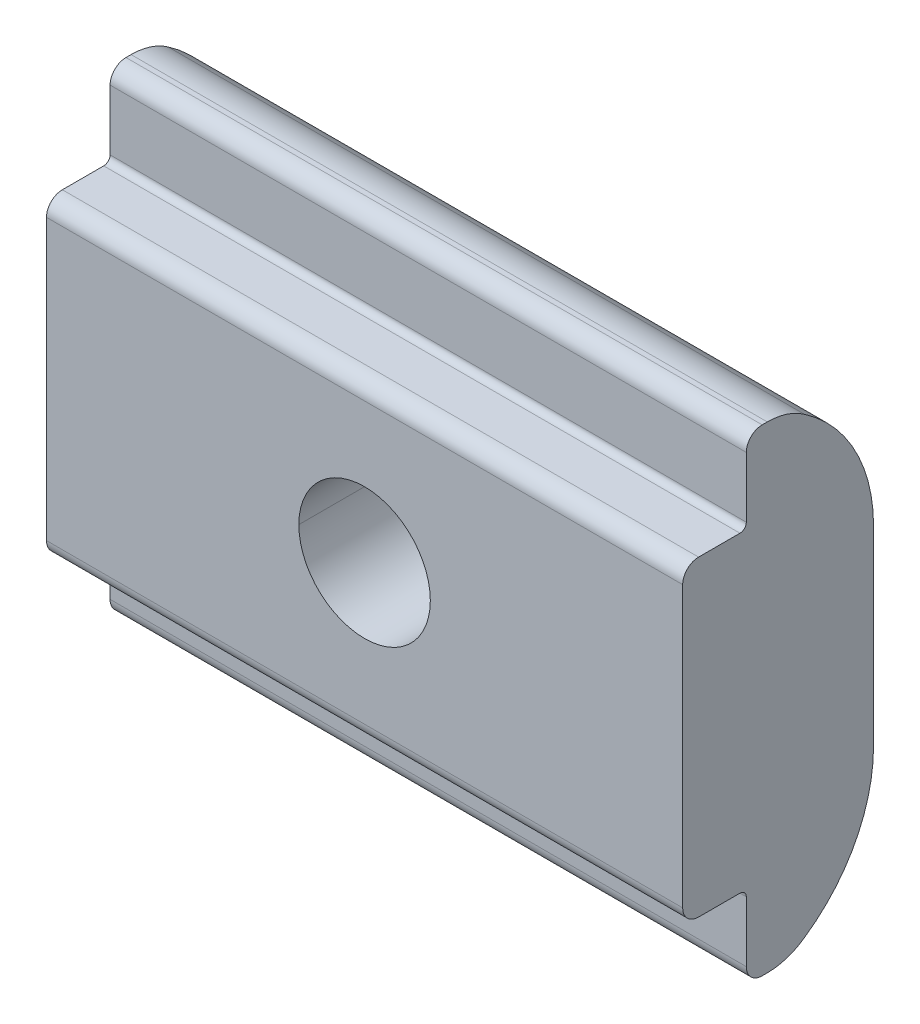
ISO-10303-21;
HEADER;
FILE_DESCRIPTION(('STEP AP214'),'2;1');
FILE_NAME('part.step','',(''),(''),'','','');
FILE_SCHEMA(('AUTOMOTIVE_DESIGN { 1 0 10303 214 1 1 1 1 }'));
ENDSEC;
DATA;
#1=APPLICATION_CONTEXT('core data for automotive mechanical design processes');
#2=APPLICATION_PROTOCOL_DEFINITION('international standard','automotive_design',2000,#1);
#3=PRODUCT_CONTEXT('',#1,'mechanical');
#4=PRODUCT('Part','Part','',(#3));
#5=PRODUCT_RELATED_PRODUCT_CATEGORY('part','',(#4));
#6=PRODUCT_DEFINITION_FORMATION('','',#4);
#7=PRODUCT_DEFINITION_CONTEXT('part definition',#1,'design');
#8=PRODUCT_DEFINITION('design','',#6,#7);
#9=PRODUCT_DEFINITION_SHAPE('','',#8);
#10=(LENGTH_UNIT() NAMED_UNIT(*) SI_UNIT(.MILLI.,.METRE.));
#11=(NAMED_UNIT(*) PLANE_ANGLE_UNIT() SI_UNIT($,.RADIAN.));
#12=(NAMED_UNIT(*) SI_UNIT($,.STERADIAN.) SOLID_ANGLE_UNIT());
#13=UNCERTAINTY_MEASURE_WITH_UNIT(LENGTH_MEASURE(1.E-05),#10,'distance_accuracy_value','');
#14=(GEOMETRIC_REPRESENTATION_CONTEXT(3) GLOBAL_UNCERTAINTY_ASSIGNED_CONTEXT((#13)) GLOBAL_UNIT_ASSIGNED_CONTEXT((#10,
#11,#12)) REPRESENTATION_CONTEXT('',''));
#15=CARTESIAN_POINT('',(0.,0.,0.));
#16=DIRECTION('',(0.,0.,1.));
#17=DIRECTION('',(1.,0.,0.));
#18=AXIS2_PLACEMENT_3D('',#15,#16,#17);
#19=CARTESIAN_POINT('',(10.,4.4,0.));
#20=DIRECTION('',(0.,0.,-1.));
#21=DIRECTION('',(-1.,0.,0.));
#22=AXIS2_PLACEMENT_3D('',#19,#20,#21);
#23=PLANE('',#22);
#24=CARTESIAN_POINT('',(0.,0.,0.));
#25=DIRECTION('',(0.,0.,1.));
#26=DIRECTION('',(1.,0.,0.));
#27=AXIS2_PLACEMENT_3D('',#24,#25,#26);
#28=CIRCLE('',#27,2.067);
#29=CARTESIAN_POINT('',(-2.067,0.,0.));
#30=VERTEX_POINT('',#29);
#31=CARTESIAN_POINT('',(2.067,0.,0.));
#32=VERTEX_POINT('',#31);
#33=EDGE_CURVE('E11',#30,#32,#28,.T.);
#34=ORIENTED_EDGE('',*,*,#33,.F.);
#35=CARTESIAN_POINT('',(0.,0.,0.));
#36=DIRECTION('',(0.,0.,1.));
#37=DIRECTION('',(1.,0.,0.));
#38=AXIS2_PLACEMENT_3D('',#35,#36,#37);
#39=CIRCLE('',#38,2.067);
#40=EDGE_CURVE('E25',#32,#30,#39,.T.);
#41=ORIENTED_EDGE('',*,*,#40,.F.);
#42=EDGE_LOOP('',(#34,#41));
#43=FACE_BOUND('',#42,.T.);
#44=DIRECTION('',(0.,-1.,0.));
#45=VECTOR('',#44,1.);
#46=CARTESIAN_POINT('',(-10.,4.4,0.));
#47=LINE('',#46,#45);
#48=CARTESIAN_POINT('',(-10.,4.4,0.));
#49=VERTEX_POINT('',#48);
#50=CARTESIAN_POINT('',(-10.,-4.4,0.));
#51=VERTEX_POINT('',#50);
#52=EDGE_CURVE('E407',#49,#51,#47,.T.);
#53=ORIENTED_EDGE('',*,*,#52,.T.);
#54=DIRECTION('',(-1.,0.,0.));
#55=VECTOR('',#54,1.);
#56=CARTESIAN_POINT('',(10.,-4.4,0.));
#57=LINE('',#56,#55);
#58=CARTESIAN_POINT('',(10.,-4.4,0.));
#59=VERTEX_POINT('',#58);
#60=EDGE_CURVE('E167',#59,#51,#57,.T.);
#61=ORIENTED_EDGE('',*,*,#60,.F.);
#62=DIRECTION('',(0.,-1.,0.));
#63=VECTOR('',#62,1.);
#64=CARTESIAN_POINT('',(10.,4.4,0.));
#65=LINE('',#64,#63);
#66=CARTESIAN_POINT('',(10.,4.4,0.));
#67=VERTEX_POINT('',#66);
#68=EDGE_CURVE('E399',#67,#59,#65,.T.);
#69=ORIENTED_EDGE('',*,*,#68,.F.);
#70=DIRECTION('',(-1.,0.,0.));
#71=VECTOR('',#70,1.);
#72=CARTESIAN_POINT('',(10.,4.4,0.));
#73=LINE('',#72,#71);
#74=EDGE_CURVE('E395',#67,#49,#73,.T.);
#75=ORIENTED_EDGE('',*,*,#74,.T.);
#76=EDGE_LOOP('',(#53,#61,#69,#75));
#77=FACE_BOUND('',#76,.T.);
#78=ADVANCED_FACE('F17',(#43,#77),#23,.F.);
#79=CARTESIAN_POINT('',(10.,4.4,-0.499999999999962));
#80=DIRECTION('',(-1.,0.,0.));
#81=DIRECTION('',(0.,-0.707106781186575,-0.70710678118652));
#82=AXIS2_PLACEMENT_3D('',#79,#80,#81);
#83=CYLINDRICAL_SURFACE('',#82,0.499999999999961);
#84=CARTESIAN_POINT('',(-10.,4.4,-0.499999999999962));
#85=DIRECTION('',(1.,0.,0.));
#86=DIRECTION('',(0.,0.,-1.));
#87=AXIS2_PLACEMENT_3D('',#84,#85,#86);
#88=CIRCLE('',#87,0.499999999999961);
#89=CARTESIAN_POINT('',(-10.,4.9,-0.5));
#90=VERTEX_POINT('',#89);
#91=EDGE_CURVE('E390',#90,#49,#88,.T.);
#92=ORIENTED_EDGE('',*,*,#91,.T.);
#93=ORIENTED_EDGE('',*,*,#74,.F.);
#94=CARTESIAN_POINT('',(10.,4.4,-0.499999999999962));
#95=DIRECTION('',(1.,0.,0.));
#96=DIRECTION('',(0.,0.,-1.));
#97=AXIS2_PLACEMENT_3D('',#94,#95,#96);
#98=CIRCLE('',#97,0.499999999999961);
#99=CARTESIAN_POINT('',(10.,4.9,-0.5));
#100=VERTEX_POINT('',#99);
#101=EDGE_CURVE('E385',#100,#67,#98,.T.);
#102=ORIENTED_EDGE('',*,*,#101,.F.);
#103=DIRECTION('',(-1.,0.,0.));
#104=VECTOR('',#103,1.);
#105=CARTESIAN_POINT('',(10.,4.9,-0.5));
#106=LINE('',#105,#104);
#107=EDGE_CURVE('E381',#100,#90,#106,.T.);
#108=ORIENTED_EDGE('',*,*,#107,.T.);
#109=EDGE_LOOP('',(#92,#93,#102,#108));
#110=FACE_BOUND('',#109,.T.);
#111=ADVANCED_FACE('F446',(#110),#83,.T.);
#112=CARTESIAN_POINT('',(10.,4.9,-1.8));
#113=DIRECTION('',(0.,-1.,0.));
#114=DIRECTION('',(0.,0.,-1.));
#115=AXIS2_PLACEMENT_3D('',#112,#113,#114);
#116=PLANE('',#115);
#117=DIRECTION('',(0.,0.,1.));
#118=VECTOR('',#117,1.);
#119=CARTESIAN_POINT('',(-10.,4.9,-1.8));
#120=LINE('',#119,#118);
#121=CARTESIAN_POINT('',(-10.,4.9,-1.8));
#122=VERTEX_POINT('',#121);
#123=EDGE_CURVE('E376',#122,#90,#120,.T.);
#124=ORIENTED_EDGE('',*,*,#123,.T.);
#125=ORIENTED_EDGE('',*,*,#107,.F.);
#126=DIRECTION('',(0.,0.,1.));
#127=VECTOR('',#126,1.);
#128=CARTESIAN_POINT('',(10.,4.9,-1.8));
#129=LINE('',#128,#127);
#130=CARTESIAN_POINT('',(10.,4.9,-1.8));
#131=VERTEX_POINT('',#130);
#132=EDGE_CURVE('E371',#131,#100,#129,.T.);
#133=ORIENTED_EDGE('',*,*,#132,.F.);
#134=DIRECTION('',(-1.,0.,0.));
#135=VECTOR('',#134,1.);
#136=CARTESIAN_POINT('',(10.,4.9,-1.8));
#137=LINE('',#136,#135);
#138=EDGE_CURVE('E367',#131,#122,#137,.T.);
#139=ORIENTED_EDGE('',*,*,#138,.T.);
#140=EDGE_LOOP('',(#124,#125,#133,#139));
#141=FACE_BOUND('',#140,.T.);
#142=ADVANCED_FACE('F449',(#141),#116,.F.);
#143=CARTESIAN_POINT('',(10.,5.1,-1.79999999999997));
#144=DIRECTION('',(-1.,0.,0.));
#145=DIRECTION('',(0.,0.707106781186495,0.7071067811866));
#146=AXIS2_PLACEMENT_3D('',#143,#144,#145);
#147=CYLINDRICAL_SURFACE('',#146,0.200000000000032);
#148=CARTESIAN_POINT('',(-10.,5.1,-1.79999999999997));
#149=DIRECTION('',(1.,0.,0.));
#150=DIRECTION('',(0.,0.,-1.));
#151=AXIS2_PLACEMENT_3D('',#148,#149,#150);
#152=CIRCLE('',#151,0.200000000000032);
#153=CARTESIAN_POINT('',(-10.,5.1,-2.));
#154=VERTEX_POINT('',#153);
#155=EDGE_CURVE('E362',#122,#154,#152,.T.);
#156=ORIENTED_EDGE('',*,*,#155,.F.);
#157=ORIENTED_EDGE('',*,*,#138,.F.);
#158=CARTESIAN_POINT('',(10.,5.1,-1.79999999999997));
#159=DIRECTION('',(1.,0.,0.));
#160=DIRECTION('',(0.,0.,-1.));
#161=AXIS2_PLACEMENT_3D('',#158,#159,#160);
#162=CIRCLE('',#161,0.200000000000032);
#163=CARTESIAN_POINT('',(10.,5.1,-2.));
#164=VERTEX_POINT('',#163);
#165=EDGE_CURVE('E358',#131,#164,#162,.T.);
#166=ORIENTED_EDGE('',*,*,#165,.T.);
#167=DIRECTION('',(-1.,0.,0.));
#168=VECTOR('',#167,1.);
#169=CARTESIAN_POINT('',(10.,5.1,-2.));
#170=LINE('',#169,#168);
#171=EDGE_CURVE('E354',#164,#154,#170,.T.);
#172=ORIENTED_EDGE('',*,*,#171,.T.);
#173=EDGE_LOOP('',(#156,#157,#166,#172));
#174=FACE_BOUND('',#173,.T.);
#175=ADVANCED_FACE('F454',(#174),#147,.F.);
#176=CARTESIAN_POINT('',(10.,7.,-2.));
#177=DIRECTION('',(0.,0.,-1.));
#178=DIRECTION('',(-1.,0.,0.));
#179=AXIS2_PLACEMENT_3D('',#176,#177,#178);
#180=PLANE('',#179);
#181=DIRECTION('',(0.,-1.,0.));
#182=VECTOR('',#181,1.);
#183=CARTESIAN_POINT('',(-10.,7.,-2.));
#184=LINE('',#183,#182);
#185=CARTESIAN_POINT('',(-10.,7.,-2.));
#186=VERTEX_POINT('',#185);
#187=EDGE_CURVE('E349',#186,#154,#184,.T.);
#188=ORIENTED_EDGE('',*,*,#187,.T.);
#189=ORIENTED_EDGE('',*,*,#171,.F.);
#190=DIRECTION('',(0.,-1.,0.));
#191=VECTOR('',#190,1.);
#192=CARTESIAN_POINT('',(10.,7.,-2.));
#193=LINE('',#192,#191);
#194=CARTESIAN_POINT('',(10.,7.,-2.));
#195=VERTEX_POINT('',#194);
#196=EDGE_CURVE('E344',#195,#164,#193,.T.);
#197=ORIENTED_EDGE('',*,*,#196,.F.);
#198=DIRECTION('',(-1.,0.,0.));
#199=VECTOR('',#198,1.);
#200=CARTESIAN_POINT('',(10.,7.,-2.));
#201=LINE('',#200,#199);
#202=EDGE_CURVE('E340',#195,#186,#201,.T.);
#203=ORIENTED_EDGE('',*,*,#202,.T.);
#204=EDGE_LOOP('',(#188,#189,#197,#203));
#205=FACE_BOUND('',#204,.T.);
#206=ADVANCED_FACE('F460',(#205),#180,.F.);
#207=CARTESIAN_POINT('',(10.,7.00000000000009,-2.49999999999991));
#208=DIRECTION('',(-1.,0.,0.));
#209=DIRECTION('',(0.,-0.707106781186547,-0.707106781186548));
#210=AXIS2_PLACEMENT_3D('',#207,#208,#209);
#211=CYLINDRICAL_SURFACE('',#210,0.499999999999911);
#212=CARTESIAN_POINT('',(-10.,7.00000000000009,-2.49999999999991));
#213=DIRECTION('',(1.,0.,0.));
#214=DIRECTION('',(0.,0.,-1.));
#215=AXIS2_PLACEMENT_3D('',#212,#213,#214);
#216=CIRCLE('',#215,0.499999999999911);
#217=CARTESIAN_POINT('',(-10.,7.5,-2.5));
#218=VERTEX_POINT('',#217);
#219=EDGE_CURVE('E335',#218,#186,#216,.T.);
#220=ORIENTED_EDGE('',*,*,#219,.T.);
#221=ORIENTED_EDGE('',*,*,#202,.F.);
#222=CARTESIAN_POINT('',(10.,7.00000000000009,-2.49999999999991));
#223=DIRECTION('',(1.,0.,0.));
#224=DIRECTION('',(0.,0.,-1.));
#225=AXIS2_PLACEMENT_3D('',#222,#223,#224);
#226=CIRCLE('',#225,0.499999999999911);
#227=CARTESIAN_POINT('',(10.,7.5,-2.5));
#228=VERTEX_POINT('',#227);
#229=EDGE_CURVE('E330',#228,#195,#226,.T.);
#230=ORIENTED_EDGE('',*,*,#229,.F.);
#231=DIRECTION('',(-1.,0.,0.));
#232=VECTOR('',#231,1.);
#233=CARTESIAN_POINT('',(10.,7.5,-2.5));
#234=LINE('',#233,#232);
#235=EDGE_CURVE('E326',#228,#218,#234,.T.);
#236=ORIENTED_EDGE('',*,*,#235,.T.);
#237=EDGE_LOOP('',(#220,#221,#230,#236));
#238=FACE_BOUND('',#237,.T.);
#239=ADVANCED_FACE('F463',(#238),#211,.T.);
#240=CARTESIAN_POINT('',(10.,7.5,-2.66));
#241=DIRECTION('',(0.,-1.,0.));
#242=DIRECTION('',(0.,0.,-1.));
#243=AXIS2_PLACEMENT_3D('',#240,#241,#242);
#244=PLANE('',#243);
#245=DIRECTION('',(0.,0.,1.));
#246=VECTOR('',#245,1.);
#247=CARTESIAN_POINT('',(-10.,7.5,-2.66));
#248=LINE('',#247,#246);
#249=CARTESIAN_POINT('',(-10.,7.5,-2.66));
#250=VERTEX_POINT('',#249);
#251=EDGE_CURVE('E321',#250,#218,#248,.T.);
#252=ORIENTED_EDGE('',*,*,#251,.T.);
#253=ORIENTED_EDGE('',*,*,#235,.F.);
#254=DIRECTION('',(0.,0.,1.));
#255=VECTOR('',#254,1.);
#256=CARTESIAN_POINT('',(10.,7.5,-2.66));
#257=LINE('',#256,#255);
#258=CARTESIAN_POINT('',(10.,7.5,-2.66));
#259=VERTEX_POINT('',#258);
#260=EDGE_CURVE('E316',#259,#228,#257,.T.);
#261=ORIENTED_EDGE('',*,*,#260,.F.);
#262=DIRECTION('',(-1.,0.,0.));
#263=VECTOR('',#262,1.);
#264=CARTESIAN_POINT('',(10.,7.5,-2.66));
#265=LINE('',#264,#263);
#266=EDGE_CURVE('E312',#259,#250,#265,.T.);
#267=ORIENTED_EDGE('',*,*,#266,.T.);
#268=EDGE_LOOP('',(#252,#253,#261,#267));
#269=FACE_BOUND('',#268,.T.);
#270=ADVANCED_FACE('F466',(#269),#244,.F.);
#271=CARTESIAN_POINT('',(10.,5.49999999999932,-2.65999999999978));
#272=DIRECTION('',(-1.,0.,0.));
#273=DIRECTION('',(0.,-0.951477226442029,0.307719169962134));
#274=AXIS2_PLACEMENT_3D('',#271,#272,#273);
#275=CYLINDRICAL_SURFACE('',#274,2.00000000000068);
#276=CARTESIAN_POINT('',(-10.,5.49999999999932,-2.65999999999978));
#277=DIRECTION('',(1.,0.,0.));
#278=DIRECTION('',(0.,0.,-1.));
#279=AXIS2_PLACEMENT_3D('',#276,#277,#278);
#280=CIRCLE('',#279,2.00000000000068);
#281=CARTESIAN_POINT('',(-10.,7.121235653516,-3.8311511242229));
#282=VERTEX_POINT('',#281);
#283=EDGE_CURVE('E307',#282,#250,#280,.T.);
#284=ORIENTED_EDGE('',*,*,#283,.T.);
#285=ORIENTED_EDGE('',*,*,#266,.F.);
#286=CARTESIAN_POINT('',(10.,5.49999999999932,-2.65999999999978));
#287=DIRECTION('',(1.,0.,0.));
#288=DIRECTION('',(0.,0.,-1.));
#289=AXIS2_PLACEMENT_3D('',#286,#287,#288);
#290=CIRCLE('',#289,2.00000000000068);
#291=CARTESIAN_POINT('',(10.,7.121235653516,-3.8311511242229));
#292=VERTEX_POINT('',#291);
#293=EDGE_CURVE('E302',#292,#259,#290,.T.);
#294=ORIENTED_EDGE('',*,*,#293,.F.);
#295=DIRECTION('',(-1.,0.,0.));
#296=VECTOR('',#295,1.);
#297=CARTESIAN_POINT('',(10.,7.121235653516,-3.8311511242229));
#298=LINE('',#297,#296);
#299=EDGE_CURVE('E298',#292,#282,#298,.T.);
#300=ORIENTED_EDGE('',*,*,#299,.T.);
#301=EDGE_LOOP('',(#284,#285,#294,#300));
#302=FACE_BOUND('',#301,.T.);
#303=ADVANCED_FACE('F472',(#302),#275,.T.);
#304=CARTESIAN_POINT('',(10.,3.0000000000001,-1.00000000000018));
#305=DIRECTION('',(-1.,0.,0.));
#306=DIRECTION('',(0.,-0.465709018870827,0.884937912930829));
#307=AXIS2_PLACEMENT_3D('',#304,#305,#306);
#308=CYLINDRICAL_SURFACE('',#307,4.99999999999982);
#309=CARTESIAN_POINT('',(-10.,3.0000000000001,-1.00000000000018));
#310=DIRECTION('',(1.,0.,0.));
#311=DIRECTION('',(0.,0.,-1.));
#312=AXIS2_PLACEMENT_3D('',#309,#310,#311);
#313=CIRCLE('',#312,4.99999999999982);
#314=CARTESIAN_POINT('',(-10.,3.,-6.));
#315=VERTEX_POINT('',#314);
#316=EDGE_CURVE('E293',#315,#282,#313,.T.);
#317=ORIENTED_EDGE('',*,*,#316,.T.);
#318=ORIENTED_EDGE('',*,*,#299,.F.);
#319=CARTESIAN_POINT('',(10.,3.0000000000001,-1.00000000000018));
#320=DIRECTION('',(1.,0.,0.));
#321=DIRECTION('',(0.,0.,-1.));
#322=AXIS2_PLACEMENT_3D('',#319,#320,#321);
#323=CIRCLE('',#322,4.99999999999982);
#324=CARTESIAN_POINT('',(10.,3.,-6.));
#325=VERTEX_POINT('',#324);
#326=EDGE_CURVE('E288',#325,#292,#323,.T.);
#327=ORIENTED_EDGE('',*,*,#326,.F.);
#328=DIRECTION('',(-1.,0.,0.));
#329=VECTOR('',#328,1.);
#330=CARTESIAN_POINT('',(10.,3.,-6.));
#331=LINE('',#330,#329);
#332=EDGE_CURVE('E284',#325,#315,#331,.T.);
#333=ORIENTED_EDGE('',*,*,#332,.T.);
#334=EDGE_LOOP('',(#317,#318,#327,#333));
#335=FACE_BOUND('',#334,.T.);
#336=ADVANCED_FACE('F475',(#335),#308,.T.);
#337=CARTESIAN_POINT('',(10.,-3.,-6.));
#338=DIRECTION('',(0.,0.,1.));
#339=DIRECTION('',(1.,0.,0.));
#340=AXIS2_PLACEMENT_3D('',#337,#338,#339);
#341=PLANE('',#340);
#342=CARTESIAN_POINT('',(0.,0.,-6.));
#343=DIRECTION('',(0.,0.,1.));
#344=DIRECTION('',(1.,0.,0.));
#345=AXIS2_PLACEMENT_3D('',#342,#343,#344);
#346=CIRCLE('',#345,2.067);
#347=CARTESIAN_POINT('',(2.067,0.,-6.));
#348=VERTEX_POINT('',#347);
#349=CARTESIAN_POINT('',(-2.067,0.,-6.));
#350=VERTEX_POINT('',#349);
#351=EDGE_CURVE('E280',#348,#350,#346,.T.);
#352=ORIENTED_EDGE('',*,*,#351,.T.);
#353=CARTESIAN_POINT('',(0.,0.,-6.));
#354=DIRECTION('',(0.,0.,1.));
#355=DIRECTION('',(1.,0.,0.));
#356=AXIS2_PLACEMENT_3D('',#353,#354,#355);
#357=CIRCLE('',#356,2.067);
#358=EDGE_CURVE('E276',#350,#348,#357,.T.);
#359=ORIENTED_EDGE('',*,*,#358,.T.);
#360=EDGE_LOOP('',(#352,#359));
#361=FACE_BOUND('',#360,.T.);
#362=DIRECTION('',(0.,1.,0.));
#363=VECTOR('',#362,1.);
#364=CARTESIAN_POINT('',(-10.,-3.,-6.));
#365=LINE('',#364,#363);
#366=CARTESIAN_POINT('',(-10.,-3.,-6.));
#367=VERTEX_POINT('',#366);
#368=EDGE_CURVE('E271',#367,#315,#365,.T.);
#369=ORIENTED_EDGE('',*,*,#368,.T.);
#370=ORIENTED_EDGE('',*,*,#332,.F.);
#371=DIRECTION('',(0.,1.,0.));
#372=VECTOR('',#371,1.);
#373=CARTESIAN_POINT('',(10.,-3.,-6.));
#374=LINE('',#373,#372);
#375=CARTESIAN_POINT('',(10.,-3.,-6.));
#376=VERTEX_POINT('',#375);
#377=EDGE_CURVE('E266',#376,#325,#374,.T.);
#378=ORIENTED_EDGE('',*,*,#377,.F.);
#379=DIRECTION('',(-1.,0.,0.));
#380=VECTOR('',#379,1.);
#381=CARTESIAN_POINT('',(10.,-3.,-6.));
#382=LINE('',#381,#380);
#383=EDGE_CURVE('E262',#376,#367,#382,.T.);
#384=ORIENTED_EDGE('',*,*,#383,.T.);
#385=EDGE_LOOP('',(#369,#370,#378,#384));
#386=FACE_BOUND('',#385,.T.);
#387=ADVANCED_FACE('F478',(#361,#386),#341,.F.);
#388=CARTESIAN_POINT('',(10.,-3.0000000000001,-1.00000000000018));
#389=DIRECTION('',(-1.,0.,0.));
#390=DIRECTION('',(0.,0.465709018870827,0.884937912930829));
#391=AXIS2_PLACEMENT_3D('',#388,#389,#390);
#392=CYLINDRICAL_SURFACE('',#391,4.99999999999982);
#393=CARTESIAN_POINT('',(-10.,-3.0000000000001,-1.00000000000018));
#394=DIRECTION('',(1.,0.,0.));
#395=DIRECTION('',(0.,0.,-1.));
#396=AXIS2_PLACEMENT_3D('',#393,#394,#395);
#397=CIRCLE('',#396,4.99999999999982);
#398=CARTESIAN_POINT('',(-10.,-7.121235653516,-3.8311511242229));
#399=VERTEX_POINT('',#398);
#400=EDGE_CURVE('E257',#399,#367,#397,.T.);
#401=ORIENTED_EDGE('',*,*,#400,.T.);
#402=ORIENTED_EDGE('',*,*,#383,.F.);
#403=CARTESIAN_POINT('',(10.,-3.0000000000001,-1.00000000000018));
#404=DIRECTION('',(1.,0.,0.));
#405=DIRECTION('',(0.,0.,-1.));
#406=AXIS2_PLACEMENT_3D('',#403,#404,#405);
#407=CIRCLE('',#406,4.99999999999982);
#408=CARTESIAN_POINT('',(10.,-7.121235653516,-3.8311511242229));
#409=VERTEX_POINT('',#408);
#410=EDGE_CURVE('E252',#409,#376,#407,.T.);
#411=ORIENTED_EDGE('',*,*,#410,.F.);
#412=DIRECTION('',(-1.,0.,0.));
#413=VECTOR('',#412,1.);
#414=CARTESIAN_POINT('',(10.,-7.121235653516,-3.8311511242229));
#415=LINE('',#414,#413);
#416=EDGE_CURVE('E248',#409,#399,#415,.T.);
#417=ORIENTED_EDGE('',*,*,#416,.T.);
#418=EDGE_LOOP('',(#401,#402,#411,#417));
#419=FACE_BOUND('',#418,.T.);
#420=ADVANCED_FACE('F484',(#419),#392,.T.);
#421=CARTESIAN_POINT('',(10.,-5.49999999999932,-2.65999999999978));
#422=DIRECTION('',(-1.,0.,0.));
#423=DIRECTION('',(0.,0.951477226442029,0.307719169962134));
#424=AXIS2_PLACEMENT_3D('',#421,#422,#423);
#425=CYLINDRICAL_SURFACE('',#424,2.00000000000068);
#426=CARTESIAN_POINT('',(-10.,-5.49999999999932,-2.65999999999978));
#427=DIRECTION('',(1.,0.,0.));
#428=DIRECTION('',(0.,0.,-1.));
#429=AXIS2_PLACEMENT_3D('',#426,#427,#428);
#430=CIRCLE('',#429,2.00000000000068);
#431=CARTESIAN_POINT('',(-10.,-7.5,-2.66));
#432=VERTEX_POINT('',#431);
#433=EDGE_CURVE('E243',#432,#399,#430,.T.);
#434=ORIENTED_EDGE('',*,*,#433,.T.);
#435=ORIENTED_EDGE('',*,*,#416,.F.);
#436=CARTESIAN_POINT('',(10.,-5.49999999999932,-2.65999999999978));
#437=DIRECTION('',(1.,0.,0.));
#438=DIRECTION('',(0.,0.,-1.));
#439=AXIS2_PLACEMENT_3D('',#436,#437,#438);
#440=CIRCLE('',#439,2.00000000000068);
#441=CARTESIAN_POINT('',(10.,-7.5,-2.66));
#442=VERTEX_POINT('',#441);
#443=EDGE_CURVE('E238',#442,#409,#440,.T.);
#444=ORIENTED_EDGE('',*,*,#443,.F.);
#445=DIRECTION('',(-1.,0.,0.));
#446=VECTOR('',#445,1.);
#447=CARTESIAN_POINT('',(10.,-7.5,-2.66));
#448=LINE('',#447,#446);
#449=EDGE_CURVE('E234',#442,#432,#448,.T.);
#450=ORIENTED_EDGE('',*,*,#449,.T.);
#451=EDGE_LOOP('',(#434,#435,#444,#450));
#452=FACE_BOUND('',#451,.T.);
#453=ADVANCED_FACE('F487',(#452),#425,.T.);
#454=CARTESIAN_POINT('',(10.,-7.5,-2.5));
#455=DIRECTION('',(0.,1.,0.));
#456=DIRECTION('',(0.,0.,1.));
#457=AXIS2_PLACEMENT_3D('',#454,#455,#456);
#458=PLANE('',#457);
#459=DIRECTION('',(0.,0.,-1.));
#460=VECTOR('',#459,1.);
#461=CARTESIAN_POINT('',(-10.,-7.5,-2.5));
#462=LINE('',#461,#460);
#463=CARTESIAN_POINT('',(-10.,-7.5,-2.5));
#464=VERTEX_POINT('',#463);
#465=EDGE_CURVE('E229',#464,#432,#462,.T.);
#466=ORIENTED_EDGE('',*,*,#465,.T.);
#467=ORIENTED_EDGE('',*,*,#449,.F.);
#468=DIRECTION('',(0.,0.,-1.));
#469=VECTOR('',#468,1.);
#470=CARTESIAN_POINT('',(10.,-7.5,-2.5));
#471=LINE('',#470,#469);
#472=CARTESIAN_POINT('',(10.,-7.5,-2.5));
#473=VERTEX_POINT('',#472);
#474=EDGE_CURVE('E224',#473,#442,#471,.T.);
#475=ORIENTED_EDGE('',*,*,#474,.F.);
#476=DIRECTION('',(-1.,0.,0.));
#477=VECTOR('',#476,1.);
#478=CARTESIAN_POINT('',(10.,-7.5,-2.5));
#479=LINE('',#478,#477);
#480=EDGE_CURVE('E220',#473,#464,#479,.T.);
#481=ORIENTED_EDGE('',*,*,#480,.T.);
#482=EDGE_LOOP('',(#466,#467,#475,#481));
#483=FACE_BOUND('',#482,.T.);
#484=ADVANCED_FACE('F490',(#483),#458,.F.);
#485=CARTESIAN_POINT('',(10.,-7.00000000000009,-2.49999999999991));
#486=DIRECTION('',(-1.,0.,0.));
#487=DIRECTION('',(0.,0.707106781186547,-0.707106781186548));
#488=AXIS2_PLACEMENT_3D('',#485,#486,#487);
#489=CYLINDRICAL_SURFACE('',#488,0.499999999999911);
#490=CARTESIAN_POINT('',(-10.,-7.00000000000009,-2.49999999999991));
#491=DIRECTION('',(1.,0.,0.));
#492=DIRECTION('',(0.,0.,-1.));
#493=AXIS2_PLACEMENT_3D('',#490,#491,#492);
#494=CIRCLE('',#493,0.499999999999911);
#495=CARTESIAN_POINT('',(-10.,-7.,-2.));
#496=VERTEX_POINT('',#495);
#497=EDGE_CURVE('E215',#496,#464,#494,.T.);
#498=ORIENTED_EDGE('',*,*,#497,.T.);
#499=ORIENTED_EDGE('',*,*,#480,.F.);
#500=CARTESIAN_POINT('',(10.,-7.00000000000009,-2.49999999999991));
#501=DIRECTION('',(1.,0.,0.));
#502=DIRECTION('',(0.,0.,-1.));
#503=AXIS2_PLACEMENT_3D('',#500,#501,#502);
#504=CIRCLE('',#503,0.499999999999911);
#505=CARTESIAN_POINT('',(10.,-7.,-2.));
#506=VERTEX_POINT('',#505);
#507=EDGE_CURVE('E210',#506,#473,#504,.T.);
#508=ORIENTED_EDGE('',*,*,#507,.F.);
#509=DIRECTION('',(-1.,0.,0.));
#510=VECTOR('',#509,1.);
#511=CARTESIAN_POINT('',(10.,-7.,-2.));
#512=LINE('',#511,#510);
#513=EDGE_CURVE('E206',#506,#496,#512,.T.);
#514=ORIENTED_EDGE('',*,*,#513,.T.);
#515=EDGE_LOOP('',(#498,#499,#508,#514));
#516=FACE_BOUND('',#515,.T.);
#517=ADVANCED_FACE('F494',(#516),#489,.T.);
#518=CARTESIAN_POINT('',(10.,-5.1,-2.));
#519=DIRECTION('',(0.,0.,-1.));
#520=DIRECTION('',(-1.,0.,0.));
#521=AXIS2_PLACEMENT_3D('',#518,#519,#520);
#522=PLANE('',#521);
#523=DIRECTION('',(0.,-1.,0.));
#524=VECTOR('',#523,1.);
#525=CARTESIAN_POINT('',(-10.,-5.1,-2.));
#526=LINE('',#525,#524);
#527=CARTESIAN_POINT('',(-10.,-5.1,-2.));
#528=VERTEX_POINT('',#527);
#529=EDGE_CURVE('E201',#528,#496,#526,.T.);
#530=ORIENTED_EDGE('',*,*,#529,.T.);
#531=ORIENTED_EDGE('',*,*,#513,.F.);
#532=DIRECTION('',(0.,-1.,0.));
#533=VECTOR('',#532,1.);
#534=CARTESIAN_POINT('',(10.,-5.1,-2.));
#535=LINE('',#534,#533);
#536=CARTESIAN_POINT('',(10.,-5.1,-2.));
#537=VERTEX_POINT('',#536);
#538=EDGE_CURVE('E196',#537,#506,#535,.T.);
#539=ORIENTED_EDGE('',*,*,#538,.F.);
#540=DIRECTION('',(-1.,0.,0.));
#541=VECTOR('',#540,1.);
#542=CARTESIAN_POINT('',(10.,-5.1,-2.));
#543=LINE('',#542,#541);
#544=EDGE_CURVE('E192',#537,#528,#543,.T.);
#545=ORIENTED_EDGE('',*,*,#544,.T.);
#546=EDGE_LOOP('',(#530,#531,#539,#545));
#547=FACE_BOUND('',#546,.T.);
#548=ADVANCED_FACE('F497',(#547),#522,.F.);
#549=CARTESIAN_POINT('',(10.,-5.1,-1.79999999999997));
#550=DIRECTION('',(-1.,0.,0.));
#551=DIRECTION('',(0.,-0.707106781186495,0.707106781186601));
#552=AXIS2_PLACEMENT_3D('',#549,#550,#551);
#553=CYLINDRICAL_SURFACE('',#552,0.200000000000032);
#554=CARTESIAN_POINT('',(-10.,-5.1,-1.79999999999997));
#555=DIRECTION('',(1.,0.,0.));
#556=DIRECTION('',(0.,0.,-1.));
#557=AXIS2_PLACEMENT_3D('',#554,#555,#556);
#558=CIRCLE('',#557,0.200000000000032);
#559=CARTESIAN_POINT('',(-10.,-4.9,-1.8));
#560=VERTEX_POINT('',#559);
#561=EDGE_CURVE('E175',#528,#560,#558,.T.);
#562=ORIENTED_EDGE('',*,*,#561,.F.);
#563=ORIENTED_EDGE('',*,*,#544,.F.);
#564=CARTESIAN_POINT('',(10.,-5.1,-1.79999999999997));
#565=DIRECTION('',(1.,0.,0.));
#566=DIRECTION('',(0.,0.,-1.));
#567=AXIS2_PLACEMENT_3D('',#564,#565,#566);
#568=CIRCLE('',#567,0.200000000000032);
#569=CARTESIAN_POINT('',(10.,-4.9,-1.8));
#570=VERTEX_POINT('',#569);
#571=EDGE_CURVE('E178',#537,#570,#568,.T.);
#572=ORIENTED_EDGE('',*,*,#571,.T.);
#573=DIRECTION('',(-1.,0.,0.));
#574=VECTOR('',#573,1.);
#575=CARTESIAN_POINT('',(10.,-4.9,-1.8));
#576=LINE('',#575,#574);
#577=EDGE_CURVE('E176',#570,#560,#576,.T.);
#578=ORIENTED_EDGE('',*,*,#577,.T.);
#579=EDGE_LOOP('',(#562,#563,#572,#578));
#580=FACE_BOUND('',#579,.T.);
#581=ADVANCED_FACE('F500',(#580),#553,.F.);
#582=CARTESIAN_POINT('',(10.,-4.9,-0.5));
#583=DIRECTION('',(0.,1.,0.));
#584=DIRECTION('',(0.,0.,1.));
#585=AXIS2_PLACEMENT_3D('',#582,#583,#584);
#586=PLANE('',#585);
#587=DIRECTION('',(0.,0.,-1.));
#588=VECTOR('',#587,1.);
#589=CARTESIAN_POINT('',(-10.,-4.9,-0.5));
#590=LINE('',#589,#588);
#591=CARTESIAN_POINT('',(-10.,-4.9,-0.5));
#592=VERTEX_POINT('',#591);
#593=EDGE_CURVE('E155',#592,#560,#590,.T.);
#594=ORIENTED_EDGE('',*,*,#593,.T.);
#595=ORIENTED_EDGE('',*,*,#577,.F.);
#596=DIRECTION('',(0.,0.,-1.));
#597=VECTOR('',#596,1.);
#598=CARTESIAN_POINT('',(10.,-4.9,-0.5));
#599=LINE('',#598,#597);
#600=CARTESIAN_POINT('',(10.,-4.9,-0.5));
#601=VERTEX_POINT('',#600);
#602=EDGE_CURVE('E158',#601,#570,#599,.T.);
#603=ORIENTED_EDGE('',*,*,#602,.F.);
#604=DIRECTION('',(-1.,0.,0.));
#605=VECTOR('',#604,1.);
#606=CARTESIAN_POINT('',(10.,-4.9,-0.5));
#607=LINE('',#606,#605);
#608=EDGE_CURVE('E150',#601,#592,#607,.T.);
#609=ORIENTED_EDGE('',*,*,#608,.T.);
#610=EDGE_LOOP('',(#594,#595,#603,#609));
#611=FACE_BOUND('',#610,.T.);
#612=ADVANCED_FACE('F152',(#611),#586,.F.);
#613=CARTESIAN_POINT('',(10.,-4.4,-0.499999999999962));
#614=DIRECTION('',(-1.,0.,0.));
#615=DIRECTION('',(0.,0.707106781186574,-0.707106781186521));
#616=AXIS2_PLACEMENT_3D('',#613,#614,#615);
#617=CYLINDRICAL_SURFACE('',#616,0.499999999999962);
#618=CARTESIAN_POINT('',(-10.,-4.4,-0.499999999999962));
#619=DIRECTION('',(1.,0.,0.));
#620=DIRECTION('',(0.,0.,-1.));
#621=AXIS2_PLACEMENT_3D('',#618,#619,#620);
#622=CIRCLE('',#621,0.499999999999962);
#623=EDGE_CURVE('E162',#51,#592,#622,.T.);
#624=ORIENTED_EDGE('',*,*,#623,.T.);
#625=ORIENTED_EDGE('',*,*,#608,.F.);
#626=CARTESIAN_POINT('',(10.,-4.4,-0.499999999999962));
#627=DIRECTION('',(1.,0.,0.));
#628=DIRECTION('',(0.,0.,-1.));
#629=AXIS2_PLACEMENT_3D('',#626,#627,#628);
#630=CIRCLE('',#629,0.499999999999962);
#631=EDGE_CURVE('E170',#59,#601,#630,.T.);
#632=ORIENTED_EDGE('',*,*,#631,.F.);
#633=ORIENTED_EDGE('',*,*,#60,.T.);
#634=EDGE_LOOP('',(#624,#625,#632,#633));
#635=FACE_BOUND('',#634,.T.);
#636=ADVANCED_FACE('F166',(#635),#617,.T.);
#637=CARTESIAN_POINT('',(10.,-4.4,-0.499999999999962));
#638=DIRECTION('',(1.,0.,0.));
#639=DIRECTION('',(0.,0.,-1.));
#640=AXIS2_PLACEMENT_3D('',#637,#638,#639);
#641=PLANE('',#640);
#642=ORIENTED_EDGE('',*,*,#68,.T.);
#643=ORIENTED_EDGE('',*,*,#631,.T.);
#644=ORIENTED_EDGE('',*,*,#602,.T.);
#645=ORIENTED_EDGE('',*,*,#571,.F.);
#646=ORIENTED_EDGE('',*,*,#538,.T.);
#647=ORIENTED_EDGE('',*,*,#507,.T.);
#648=ORIENTED_EDGE('',*,*,#474,.T.);
#649=ORIENTED_EDGE('',*,*,#443,.T.);
#650=ORIENTED_EDGE('',*,*,#410,.T.);
#651=ORIENTED_EDGE('',*,*,#377,.T.);
#652=ORIENTED_EDGE('',*,*,#326,.T.);
#653=ORIENTED_EDGE('',*,*,#293,.T.);
#654=ORIENTED_EDGE('',*,*,#260,.T.);
#655=ORIENTED_EDGE('',*,*,#229,.T.);
#656=ORIENTED_EDGE('',*,*,#196,.T.);
#657=ORIENTED_EDGE('',*,*,#165,.F.);
#658=ORIENTED_EDGE('',*,*,#132,.T.);
#659=ORIENTED_EDGE('',*,*,#101,.T.);
#660=EDGE_LOOP('',(#642,#643,#644,#645,#646,#647,#648,#649,#650,#651,#652,#653,#654,#655,#656,
#657,#658,#659));
#661=FACE_BOUND('',#660,.T.);
#662=ADVANCED_FACE('F439',(#661),#641,.T.);
#663=CARTESIAN_POINT('',(-10.,-4.4,-0.499999999999962));
#664=DIRECTION('',(1.,0.,0.));
#665=DIRECTION('',(0.,0.,-1.));
#666=AXIS2_PLACEMENT_3D('',#663,#664,#665);
#667=PLANE('',#666);
#668=ORIENTED_EDGE('',*,*,#52,.F.);
#669=ORIENTED_EDGE('',*,*,#91,.F.);
#670=ORIENTED_EDGE('',*,*,#123,.F.);
#671=ORIENTED_EDGE('',*,*,#155,.T.);
#672=ORIENTED_EDGE('',*,*,#187,.F.);
#673=ORIENTED_EDGE('',*,*,#219,.F.);
#674=ORIENTED_EDGE('',*,*,#251,.F.);
#675=ORIENTED_EDGE('',*,*,#283,.F.);
#676=ORIENTED_EDGE('',*,*,#316,.F.);
#677=ORIENTED_EDGE('',*,*,#368,.F.);
#678=ORIENTED_EDGE('',*,*,#400,.F.);
#679=ORIENTED_EDGE('',*,*,#433,.F.);
#680=ORIENTED_EDGE('',*,*,#465,.F.);
#681=ORIENTED_EDGE('',*,*,#497,.F.);
#682=ORIENTED_EDGE('',*,*,#529,.F.);
#683=ORIENTED_EDGE('',*,*,#561,.T.);
#684=ORIENTED_EDGE('',*,*,#593,.F.);
#685=ORIENTED_EDGE('',*,*,#623,.F.);
#686=EDGE_LOOP('',(#668,#669,#670,#671,#672,#673,#674,#675,#676,#677,#678,#679,#680,#681,#682,
#683,#684,#685));
#687=FACE_BOUND('',#686,.T.);
#688=ADVANCED_FACE('F172',(#687),#667,.F.);
#689=CARTESIAN_POINT('',(0.,0.,0.));
#690=DIRECTION('',(0.,0.,1.));
#691=DIRECTION('',(0.,1.,0.));
#692=AXIS2_PLACEMENT_3D('',#689,#690,#691);
#693=CYLINDRICAL_SURFACE('',#692,2.067);
#694=DIRECTION('',(0.,0.,1.));
#695=VECTOR('',#694,1.);
#696=CARTESIAN_POINT('',(-2.067,0.,-6.));
#697=LINE('',#696,#695);
#698=EDGE_CURVE('E419',#350,#30,#697,.T.);
#699=ORIENTED_EDGE('',*,*,#698,.T.);
#700=ORIENTED_EDGE('',*,*,#33,.T.);
#701=DIRECTION('',(0.,0.,1.));
#702=VECTOR('',#701,1.);
#703=CARTESIAN_POINT('',(2.067,0.,-6.));
#704=LINE('',#703,#702);
#705=EDGE_CURVE('E421',#348,#32,#704,.T.);
#706=ORIENTED_EDGE('',*,*,#705,.F.);
#707=ORIENTED_EDGE('',*,*,#358,.F.);
#708=EDGE_LOOP('',(#699,#700,#706,#707));
#709=FACE_BOUND('',#708,.T.);
#710=ADVANCED_FACE('F425',(#709),#693,.F.);
#711=CARTESIAN_POINT('',(0.,0.,0.));
#712=DIRECTION('',(0.,0.,1.));
#713=DIRECTION('',(0.,-1.,0.));
#714=AXIS2_PLACEMENT_3D('',#711,#712,#713);
#715=CYLINDRICAL_SURFACE('',#714,2.067);
#716=ORIENTED_EDGE('',*,*,#698,.F.);
#717=ORIENTED_EDGE('',*,*,#351,.F.);
#718=ORIENTED_EDGE('',*,*,#705,.T.);
#719=ORIENTED_EDGE('',*,*,#40,.T.);
#720=EDGE_LOOP('',(#716,#717,#718,#719));
#721=FACE_BOUND('',#720,.T.);
#722=ADVANCED_FACE('F417',(#721),#715,.F.);
#723=CLOSED_SHELL('',(#78,#111,#142,#175,#206,#239,#270,#303,#336,#387,#420,#453,#484,#517,#548,
#581,#612,#636,#662,#688,#710,#722));
#724=MANIFOLD_SOLID_BREP('B1',#723);
#725=ADVANCED_BREP_SHAPE_REPRESENTATION('',(#18,#724),#14);
#726=SHAPE_DEFINITION_REPRESENTATION(#9,#725);
ENDSEC;
END-ISO-10303-21;
